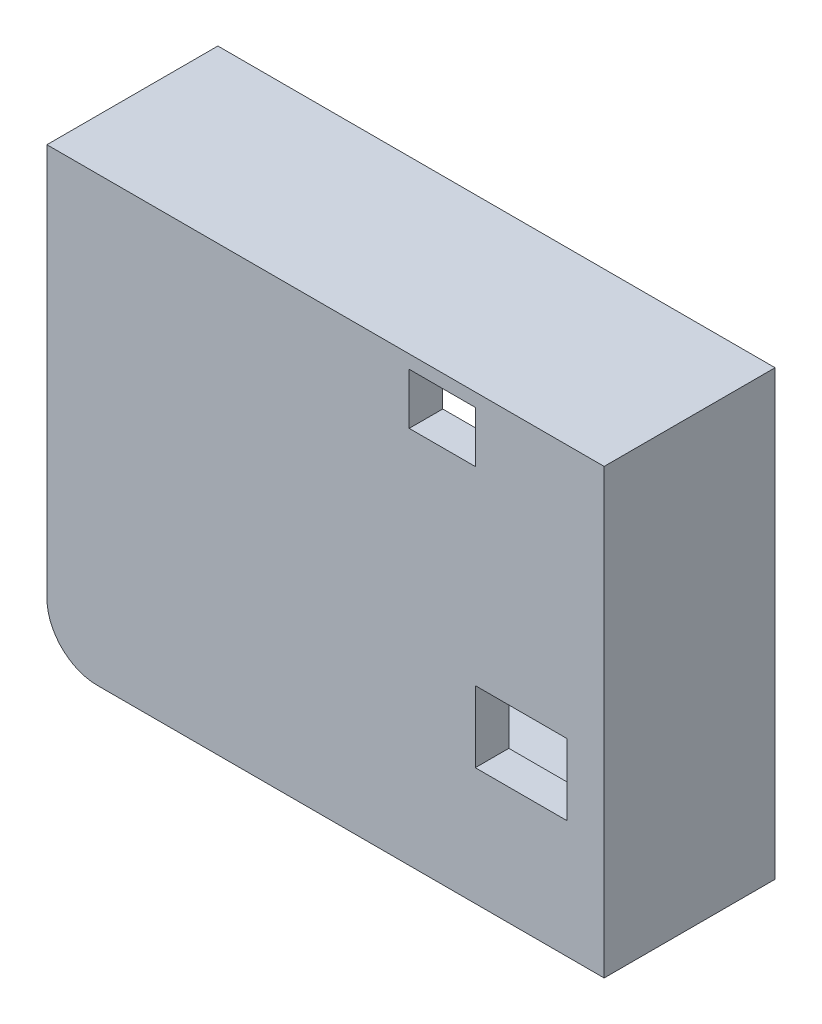
ISO-10303-21;
HEADER;
FILE_DESCRIPTION(('STEP AP214'),'2;1');
FILE_NAME('part.step','',(''),(''),'','','');
FILE_SCHEMA(('AUTOMOTIVE_DESIGN { 1 0 10303 214 1 1 1 1 }'));
ENDSEC;
DATA;
#1=APPLICATION_CONTEXT('core data for automotive mechanical design processes');
#2=APPLICATION_PROTOCOL_DEFINITION('international standard','automotive_design',2000,#1);
#3=PRODUCT_CONTEXT('',#1,'mechanical');
#4=PRODUCT('Part','Part','',(#3));
#5=PRODUCT_RELATED_PRODUCT_CATEGORY('part','',(#4));
#6=PRODUCT_DEFINITION_FORMATION('','',#4);
#7=PRODUCT_DEFINITION_CONTEXT('part definition',#1,'design');
#8=PRODUCT_DEFINITION('design','',#6,#7);
#9=PRODUCT_DEFINITION_SHAPE('','',#8);
#10=(LENGTH_UNIT() NAMED_UNIT(*) SI_UNIT(.MILLI.,.METRE.));
#11=(NAMED_UNIT(*) PLANE_ANGLE_UNIT() SI_UNIT($,.RADIAN.));
#12=(NAMED_UNIT(*) SI_UNIT($,.STERADIAN.) SOLID_ANGLE_UNIT());
#13=UNCERTAINTY_MEASURE_WITH_UNIT(LENGTH_MEASURE(1.E-05),#10,'distance_accuracy_value','');
#14=(GEOMETRIC_REPRESENTATION_CONTEXT(3) GLOBAL_UNCERTAINTY_ASSIGNED_CONTEXT((#13)) GLOBAL_UNIT_ASSIGNED_CONTEXT((#10,
#11,#12)) REPRESENTATION_CONTEXT('',''));
#15=CARTESIAN_POINT('',(0.,0.,0.));
#16=DIRECTION('',(0.,0.,1.));
#17=DIRECTION('',(1.,0.,0.));
#18=AXIS2_PLACEMENT_3D('',#15,#16,#17);
#19=CARTESIAN_POINT('',(0.,-125.165005985879,-48.6260540747564));
#20=DIRECTION('',(0.,-1.,0.));
#21=DIRECTION('',(0.,0.,-1.));
#22=AXIS2_PLACEMENT_3D('',#19,#20,#21);
#23=PLANE('',#22);
#24=DIRECTION('',(1.,0.,0.));
#25=VECTOR('',#24,1.);
#26=CARTESIAN_POINT('',(0.,-125.165005985879,4.));
#27=LINE('',#26,#25);
#28=CARTESIAN_POINT('',(134.091872,-125.165005985879,4.));
#29=VERTEX_POINT('',#28);
#30=CARTESIAN_POINT('',(164.307694987294,-125.165005985879,4.));
#31=VERTEX_POINT('',#30);
#32=EDGE_CURVE('E207',#29,#31,#27,.T.);
#33=ORIENTED_EDGE('',*,*,#32,.F.);
#34=DIRECTION('',(0.,0.,-1.));
#35=VECTOR('',#34,1.);
#36=CARTESIAN_POINT('',(134.091872,-125.165005985879,2.));
#37=LINE('',#36,#35);
#38=CARTESIAN_POINT('',(134.091872,-125.165005985879,2.));
#39=VERTEX_POINT('',#38);
#40=EDGE_CURVE('E313',#29,#39,#37,.T.);
#41=ORIENTED_EDGE('',*,*,#40,.T.);
#42=DIRECTION('',(0.,0.,1.));
#43=VECTOR('',#42,1.);
#44=CARTESIAN_POINT('',(134.091872,-125.165005985879,-6.19000000000001));
#45=LINE('',#44,#43);
#46=CARTESIAN_POINT('',(134.091872,-125.165005985879,-6.19000000000001));
#47=VERTEX_POINT('',#46);
#48=EDGE_CURVE('E304',#39,#47,#45,.F.);
#49=ORIENTED_EDGE('',*,*,#48,.T.);
#50=DIRECTION('',(-1.,0.,0.));
#51=VECTOR('',#50,1.);
#52=CARTESIAN_POINT('',(0.,-125.165005985879,-6.19000000000001));
#53=LINE('',#52,#51);
#54=CARTESIAN_POINT('',(164.307694987294,-125.165005985879,-6.19000000000001));
#55=VERTEX_POINT('',#54);
#56=EDGE_CURVE('E252',#55,#47,#53,.T.);
#57=ORIENTED_EDGE('',*,*,#56,.F.);
#58=DIRECTION('',(0.,0.,1.));
#59=VECTOR('',#58,1.);
#60=CARTESIAN_POINT('',(164.307694987294,-125.165005985879,-48.6260540747564));
#61=LINE('',#60,#59);
#62=EDGE_CURVE('E244',#55,#31,#61,.T.);
#63=ORIENTED_EDGE('',*,*,#62,.T.);
#64=EDGE_LOOP('',(#33,#41,#49,#57,#63));
#65=FACE_BOUND('',#64,.T.);
#66=ADVANCED_FACE('F35',(#65),#23,.T.);
#67=CARTESIAN_POINT('',(131.091872,0.,-48.6260540747564));
#68=DIRECTION('',(1.,0.,0.));
#69=DIRECTION('',(0.,0.,-1.));
#70=AXIS2_PLACEMENT_3D('',#67,#68,#69);
#71=PLANE('',#70);
#72=DIRECTION('',(0.,0.,1.));
#73=VECTOR('',#72,1.);
#74=CARTESIAN_POINT('',(131.091872,-122.165005985879,2.));
#75=LINE('',#74,#73);
#76=CARTESIAN_POINT('',(131.091872,-122.165005985879,-6.19000000000001));
#77=VERTEX_POINT('',#76);
#78=CARTESIAN_POINT('',(131.091872,-122.165005985879,2.));
#79=VERTEX_POINT('',#78);
#80=EDGE_CURVE('E300',#77,#79,#75,.T.);
#81=ORIENTED_EDGE('',*,*,#80,.T.);
#82=DIRECTION('',(0.,0.,-1.));
#83=VECTOR('',#82,1.);
#84=CARTESIAN_POINT('',(131.091872,-122.165005985879,4.));
#85=LINE('',#84,#83);
#86=CARTESIAN_POINT('',(131.091872,-122.165005985879,4.));
#87=VERTEX_POINT('',#86);
#88=EDGE_CURVE('E43',#79,#87,#85,.F.);
#89=ORIENTED_EDGE('',*,*,#88,.T.);
#90=DIRECTION('',(0.,1.,0.));
#91=VECTOR('',#90,1.);
#92=CARTESIAN_POINT('',(131.091872,0.,4.));
#93=LINE('',#92,#91);
#94=CARTESIAN_POINT('',(131.091872,-98.7542546010274,4.));
#95=VERTEX_POINT('',#94);
#96=EDGE_CURVE('E215',#87,#95,#93,.T.);
#97=ORIENTED_EDGE('',*,*,#96,.T.);
#98=DIRECTION('',(0.,0.,1.));
#99=VECTOR('',#98,1.);
#100=CARTESIAN_POINT('',(131.091872,-98.7542546010274,-48.6260540747564));
#101=LINE('',#100,#99);
#102=CARTESIAN_POINT('',(131.091872,-98.7542546010274,-6.19000000000001));
#103=VERTEX_POINT('',#102);
#104=EDGE_CURVE('E268',#103,#95,#101,.T.);
#105=ORIENTED_EDGE('',*,*,#104,.F.);
#106=DIRECTION('',(0.,-1.,0.));
#107=VECTOR('',#106,1.);
#108=CARTESIAN_POINT('',(131.091872,0.,-6.19000000000001));
#109=LINE('',#108,#107);
#110=EDGE_CURVE('E276',#103,#77,#109,.T.);
#111=ORIENTED_EDGE('',*,*,#110,.T.);
#112=EDGE_LOOP('',(#81,#89,#97,#105,#111));
#113=FACE_BOUND('',#112,.T.);
#114=ADVANCED_FACE('F328',(#113),#71,.F.);
#115=CARTESIAN_POINT('',(0.,-98.7542546010274,-48.6260540747564));
#116=DIRECTION('',(0.,-1.,0.));
#117=DIRECTION('',(0.,0.,-1.));
#118=AXIS2_PLACEMENT_3D('',#115,#116,#117);
#119=PLANE('',#118);
#120=DIRECTION('',(0.,0.,1.));
#121=VECTOR('',#120,1.);
#122=CARTESIAN_POINT('',(164.307694987294,-98.7542546010274,-48.6260540747564));
#123=LINE('',#122,#121);
#124=CARTESIAN_POINT('',(164.307694987294,-98.7542546010274,-6.19000000000001));
#125=VERTEX_POINT('',#124);
#126=CARTESIAN_POINT('',(164.307694987294,-98.7542546010274,4.));
#127=VERTEX_POINT('',#126);
#128=EDGE_CURVE('E256',#125,#127,#123,.T.);
#129=ORIENTED_EDGE('',*,*,#128,.F.);
#130=DIRECTION('',(-1.,0.,0.));
#131=VECTOR('',#130,1.);
#132=CARTESIAN_POINT('',(0.,-98.7542546010274,-6.19000000000001));
#133=LINE('',#132,#131);
#134=EDGE_CURVE('E272',#125,#103,#133,.T.);
#135=ORIENTED_EDGE('',*,*,#134,.T.);
#136=ORIENTED_EDGE('',*,*,#104,.T.);
#137=DIRECTION('',(1.,0.,0.));
#138=VECTOR('',#137,1.);
#139=CARTESIAN_POINT('',(0.,-98.7542546010274,4.));
#140=LINE('',#139,#138);
#141=EDGE_CURVE('E212',#95,#127,#140,.T.);
#142=ORIENTED_EDGE('',*,*,#141,.T.);
#143=EDGE_LOOP('',(#129,#135,#136,#142));
#144=FACE_BOUND('',#143,.T.);
#145=ADVANCED_FACE('F332',(#144),#119,.F.);
#146=CARTESIAN_POINT('',(133.091872,0.,-48.6260540747564));
#147=DIRECTION('',(-1.,0.,0.));
#148=DIRECTION('',(0.,0.,1.));
#149=AXIS2_PLACEMENT_3D('',#146,#147,#148);
#150=PLANE('',#149);
#151=DIRECTION('',(0.,-1.,0.));
#152=VECTOR('',#151,1.);
#153=CARTESIAN_POINT('',(133.091872,0.,2.));
#154=LINE('',#153,#152);
#155=CARTESIAN_POINT('',(133.091872,-99.55,2.));
#156=VERTEX_POINT('',#155);
#157=CARTESIAN_POINT('',(133.091872,-120.165005985879,2.));
#158=VERTEX_POINT('',#157);
#159=EDGE_CURVE('E260',#156,#158,#154,.T.);
#160=ORIENTED_EDGE('',*,*,#159,.T.);
#161=DIRECTION('',(0.,0.,1.));
#162=VECTOR('',#161,1.);
#163=CARTESIAN_POINT('',(133.091872,-120.165005985879,-48.6260540747564));
#164=LINE('',#163,#162);
#165=CARTESIAN_POINT('',(133.091872,-120.165005985879,-6.19000000000001));
#166=VERTEX_POINT('',#165);
#167=EDGE_CURVE('E298',#158,#166,#164,.F.);
#168=ORIENTED_EDGE('',*,*,#167,.T.);
#169=DIRECTION('',(0.,1.,0.));
#170=VECTOR('',#169,1.);
#171=CARTESIAN_POINT('',(133.091872,0.,-6.19000000000001));
#172=LINE('',#171,#170);
#173=CARTESIAN_POINT('',(133.091872,-99.55,-6.19000000000001));
#174=VERTEX_POINT('',#173);
#175=EDGE_CURVE('E271',#166,#174,#172,.T.);
#176=ORIENTED_EDGE('',*,*,#175,.T.);
#177=DIRECTION('',(0.,0.,1.));
#178=VECTOR('',#177,1.);
#179=CARTESIAN_POINT('',(133.091872,-99.55,-48.6260540747564));
#180=LINE('',#179,#178);
#181=EDGE_CURVE('E264',#174,#156,#180,.T.);
#182=ORIENTED_EDGE('',*,*,#181,.T.);
#183=EDGE_LOOP('',(#160,#168,#176,#182));
#184=FACE_BOUND('',#183,.T.);
#185=ADVANCED_FACE('F391',(#184),#150,.F.);
#186=CARTESIAN_POINT('',(0.,-123.165005985879,-48.6260540747564));
#187=DIRECTION('',(0.,1.,0.));
#188=DIRECTION('',(0.,0.,1.));
#189=AXIS2_PLACEMENT_3D('',#186,#187,#188);
#190=PLANE('',#189);
#191=DIRECTION('',(1.,0.,0.));
#192=VECTOR('',#191,1.);
#193=CARTESIAN_POINT('',(0.,-123.165005985879,-6.19000000000001));
#194=LINE('',#193,#192);
#195=CARTESIAN_POINT('',(136.091872,-123.165005985879,-6.19000000000001));
#196=VERTEX_POINT('',#195);
#197=CARTESIAN_POINT('',(162.307694987294,-123.165005985879,-6.19000000000001));
#198=VERTEX_POINT('',#197);
#199=EDGE_CURVE('E267',#196,#198,#194,.T.);
#200=ORIENTED_EDGE('',*,*,#199,.F.);
#201=DIRECTION('',(0.,0.,1.));
#202=VECTOR('',#201,1.);
#203=CARTESIAN_POINT('',(136.091872,-123.165005985879,-48.6260540747564));
#204=LINE('',#203,#202);
#205=CARTESIAN_POINT('',(136.091872,-123.165005985879,2.));
#206=VERTEX_POINT('',#205);
#207=EDGE_CURVE('E287',#196,#206,#204,.T.);
#208=ORIENTED_EDGE('',*,*,#207,.T.);
#209=DIRECTION('',(-1.,0.,0.));
#210=VECTOR('',#209,1.);
#211=CARTESIAN_POINT('',(0.,-123.165005985879,2.));
#212=LINE('',#211,#210);
#213=CARTESIAN_POINT('',(162.307694987294,-123.165005985879,2.));
#214=VERTEX_POINT('',#213);
#215=EDGE_CURVE('E249',#214,#206,#212,.T.);
#216=ORIENTED_EDGE('',*,*,#215,.F.);
#217=DIRECTION('',(0.,0.,1.));
#218=VECTOR('',#217,1.);
#219=CARTESIAN_POINT('',(162.307694987294,-123.165005985879,-48.6260540747564));
#220=LINE('',#219,#218);
#221=EDGE_CURVE('E263',#198,#214,#220,.T.);
#222=ORIENTED_EDGE('',*,*,#221,.F.);
#223=EDGE_LOOP('',(#200,#208,#216,#222));
#224=FACE_BOUND('',#223,.T.);
#225=ADVANCED_FACE('F388',(#224),#190,.T.);
#226=CARTESIAN_POINT('',(162.307694987294,0.,-48.6260540747564));
#227=DIRECTION('',(-1.,0.,0.));
#228=DIRECTION('',(0.,0.,1.));
#229=AXIS2_PLACEMENT_3D('',#226,#227,#228);
#230=PLANE('',#229);
#231=DIRECTION('',(0.,1.,0.));
#232=VECTOR('',#231,1.);
#233=CARTESIAN_POINT('',(162.307694987294,0.,-6.19000000000001));
#234=LINE('',#233,#232);
#235=CARTESIAN_POINT('',(162.307694987294,-99.55,-6.19000000000001));
#236=VERTEX_POINT('',#235);
#237=EDGE_CURVE('E285',#198,#236,#234,.T.);
#238=ORIENTED_EDGE('',*,*,#237,.F.);
#239=ORIENTED_EDGE('',*,*,#221,.T.);
#240=DIRECTION('',(0.,-1.,0.));
#241=VECTOR('',#240,1.);
#242=CARTESIAN_POINT('',(162.307694987294,0.,2.));
#243=LINE('',#242,#241);
#244=CARTESIAN_POINT('',(162.307694987294,-99.55,2.));
#245=VERTEX_POINT('',#244);
#246=EDGE_CURVE('E253',#245,#214,#243,.T.);
#247=ORIENTED_EDGE('',*,*,#246,.F.);
#248=DIRECTION('',(0.,0.,1.));
#249=VECTOR('',#248,1.);
#250=CARTESIAN_POINT('',(162.307694987294,-99.55,-48.6260540747564));
#251=LINE('',#250,#249);
#252=EDGE_CURVE('E279',#236,#245,#251,.T.);
#253=ORIENTED_EDGE('',*,*,#252,.F.);
#254=EDGE_LOOP('',(#238,#239,#247,#253));
#255=FACE_BOUND('',#254,.T.);
#256=ADVANCED_FACE('F346',(#255),#230,.T.);
#257=CARTESIAN_POINT('',(0.,-99.55,-48.6260540747564));
#258=DIRECTION('',(0.,1.,0.));
#259=DIRECTION('',(0.,0.,1.));
#260=AXIS2_PLACEMENT_3D('',#257,#258,#259);
#261=PLANE('',#260);
#262=ORIENTED_EDGE('',*,*,#181,.F.);
#263=DIRECTION('',(1.,0.,0.));
#264=VECTOR('',#263,1.);
#265=CARTESIAN_POINT('',(0.,-99.55,-6.19000000000001));
#266=LINE('',#265,#264);
#267=EDGE_CURVE('E278',#174,#236,#266,.T.);
#268=ORIENTED_EDGE('',*,*,#267,.T.);
#269=ORIENTED_EDGE('',*,*,#252,.T.);
#270=DIRECTION('',(-1.,0.,0.));
#271=VECTOR('',#270,1.);
#272=CARTESIAN_POINT('',(0.,-99.55,2.));
#273=LINE('',#272,#271);
#274=CARTESIAN_POINT('',(156.626717908816,-99.55,2.));
#275=VERTEX_POINT('',#274);
#276=EDGE_CURVE('E257',#245,#275,#273,.T.);
#277=ORIENTED_EDGE('',*,*,#276,.T.);
#278=DIRECTION('',(0.,0.,-1.));
#279=VECTOR('',#278,1.);
#280=CARTESIAN_POINT('',(156.626717908816,-99.55,4.));
#281=LINE('',#280,#279);
#282=CARTESIAN_POINT('',(156.626717908816,-99.55,4.));
#283=VERTEX_POINT('',#282);
#284=EDGE_CURVE('E186',#283,#275,#281,.T.);
#285=ORIENTED_EDGE('',*,*,#284,.F.);
#286=DIRECTION('',(-1.,0.,0.));
#287=VECTOR('',#286,1.);
#288=CARTESIAN_POINT('',(0.,-99.55,4.));
#289=LINE('',#288,#287);
#290=CARTESIAN_POINT('',(152.68714679013,-99.55,4.));
#291=VERTEX_POINT('',#290);
#292=EDGE_CURVE('E171',#283,#291,#289,.T.);
#293=ORIENTED_EDGE('',*,*,#292,.T.);
#294=DIRECTION('',(0.,0.,-1.));
#295=VECTOR('',#294,1.);
#296=CARTESIAN_POINT('',(152.68714679013,-99.55,4.));
#297=LINE('',#296,#295);
#298=CARTESIAN_POINT('',(152.68714679013,-99.55,2.));
#299=VERTEX_POINT('',#298);
#300=EDGE_CURVE('E180',#291,#299,#297,.T.);
#301=ORIENTED_EDGE('',*,*,#300,.T.);
#302=EDGE_CURVE('E259',#299,#156,#273,.T.);
#303=ORIENTED_EDGE('',*,*,#302,.T.);
#304=EDGE_LOOP('',(#262,#268,#269,#277,#285,#293,#301,#303));
#305=FACE_BOUND('',#304,.T.);
#306=ADVANCED_FACE('F189',(#305),#261,.F.);
#307=CARTESIAN_POINT('',(164.307694987294,0.,-48.6260540747564));
#308=DIRECTION('',(1.,0.,0.));
#309=DIRECTION('',(0.,0.,-1.));
#310=AXIS2_PLACEMENT_3D('',#307,#308,#309);
#311=PLANE('',#310);
#312=DIRECTION('',(0.,-1.,0.));
#313=VECTOR('',#312,1.);
#314=CARTESIAN_POINT('',(164.307694987294,0.,-6.19000000000001));
#315=LINE('',#314,#313);
#316=EDGE_CURVE('E265',#125,#55,#315,.T.);
#317=ORIENTED_EDGE('',*,*,#316,.F.);
#318=ORIENTED_EDGE('',*,*,#128,.T.);
#319=DIRECTION('',(0.,1.,0.));
#320=VECTOR('',#319,1.);
#321=CARTESIAN_POINT('',(164.307694987294,0.,4.));
#322=LINE('',#321,#320);
#323=EDGE_CURVE('E209',#31,#127,#322,.T.);
#324=ORIENTED_EDGE('',*,*,#323,.F.);
#325=ORIENTED_EDGE('',*,*,#62,.F.);
#326=EDGE_LOOP('',(#317,#318,#324,#325));
#327=FACE_BOUND('',#326,.T.);
#328=ADVANCED_FACE('F337',(#327),#311,.T.);
#329=CARTESIAN_POINT('',(66.491872,-224.748043974981,-6.19000000000001));
#330=DIRECTION('',(0.,0.,1.));
#331=DIRECTION('',(0.,1.,0.));
#332=AXIS2_PLACEMENT_3D('',#329,#330,#331);
#333=PLANE('',#332);
#334=ORIENTED_EDGE('',*,*,#56,.T.);
#335=CARTESIAN_POINT('',(134.091872,-122.165005985879,-6.19000000000001));
#336=DIRECTION('',(0.,0.,1.));
#337=DIRECTION('',(0.,-1.,0.));
#338=AXIS2_PLACEMENT_3D('',#335,#336,#337);
#339=CIRCLE('',#338,3.);
#340=EDGE_CURVE('E306',#47,#77,#339,.F.);
#341=ORIENTED_EDGE('',*,*,#340,.T.);
#342=ORIENTED_EDGE('',*,*,#110,.F.);
#343=ORIENTED_EDGE('',*,*,#134,.F.);
#344=ORIENTED_EDGE('',*,*,#316,.T.);
#345=EDGE_LOOP('',(#334,#341,#342,#343,#344));
#346=FACE_BOUND('',#345,.T.);
#347=ORIENTED_EDGE('',*,*,#175,.F.);
#348=CARTESIAN_POINT('',(136.091872,-120.165005985879,-6.19000000000001));
#349=DIRECTION('',(0.,0.,1.));
#350=DIRECTION('',(0.,-1.,0.));
#351=AXIS2_PLACEMENT_3D('',#348,#349,#350);
#352=CIRCLE('',#351,3.);
#353=EDGE_CURVE('E311',#166,#196,#352,.T.);
#354=ORIENTED_EDGE('',*,*,#353,.T.);
#355=ORIENTED_EDGE('',*,*,#199,.T.);
#356=ORIENTED_EDGE('',*,*,#237,.T.);
#357=ORIENTED_EDGE('',*,*,#267,.F.);
#358=EDGE_LOOP('',(#347,#354,#355,#356,#357));
#359=FACE_BOUND('',#358,.T.);
#360=ADVANCED_FACE('F325',(#346,#359),#333,.F.);
#361=CARTESIAN_POINT('',(136.091872,-120.165005985879,-48.6260540747564));
#362=DIRECTION('',(0.,0.,1.));
#363=DIRECTION('',(1.,0.,0.));
#364=AXIS2_PLACEMENT_3D('',#361,#362,#363);
#365=CYLINDRICAL_SURFACE('',#364,3.);
#366=ORIENTED_EDGE('',*,*,#353,.F.);
#367=ORIENTED_EDGE('',*,*,#167,.F.);
#368=CARTESIAN_POINT('',(136.091872,-120.165005985879,2.));
#369=DIRECTION('',(0.,0.,1.));
#370=DIRECTION('',(1.,0.,0.));
#371=AXIS2_PLACEMENT_3D('',#368,#369,#370);
#372=CIRCLE('',#371,3.);
#373=EDGE_CURVE('E308',#206,#158,#372,.F.);
#374=ORIENTED_EDGE('',*,*,#373,.F.);
#375=ORIENTED_EDGE('',*,*,#207,.F.);
#376=EDGE_LOOP('',(#366,#367,#374,#375));
#377=FACE_BOUND('',#376,.T.);
#378=ADVANCED_FACE('F344',(#377),#365,.F.);
#379=CARTESIAN_POINT('',(134.091872,-122.165005985879,-48.6260540747564));
#380=DIRECTION('',(0.,0.,-1.));
#381=DIRECTION('',(-1.,0.,0.));
#382=AXIS2_PLACEMENT_3D('',#379,#380,#381);
#383=CYLINDRICAL_SURFACE('',#382,3.);
#384=ORIENTED_EDGE('',*,*,#340,.F.);
#385=ORIENTED_EDGE('',*,*,#48,.F.);
#386=CARTESIAN_POINT('',(134.091872,-122.165005985879,2.));
#387=DIRECTION('',(0.,0.,1.));
#388=DIRECTION('',(1.,0.,0.));
#389=AXIS2_PLACEMENT_3D('',#386,#387,#388);
#390=CIRCLE('',#389,3.);
#391=EDGE_CURVE('E302',#79,#39,#390,.T.);
#392=ORIENTED_EDGE('',*,*,#391,.F.);
#393=ORIENTED_EDGE('',*,*,#80,.F.);
#394=EDGE_LOOP('',(#384,#385,#392,#393));
#395=FACE_BOUND('',#394,.T.);
#396=ADVANCED_FACE('F322',(#395),#383,.T.);
#397=CARTESIAN_POINT('',(0.,-118.15,4.));
#398=DIRECTION('',(0.,-1.,0.));
#399=DIRECTION('',(0.,0.,-1.));
#400=AXIS2_PLACEMENT_3D('',#397,#398,#399);
#401=PLANE('',#400);
#402=DIRECTION('',(-1.,0.,0.));
#403=VECTOR('',#402,1.);
#404=CARTESIAN_POINT('',(0.,-118.15,2.));
#405=LINE('',#404,#403);
#406=CARTESIAN_POINT('',(162.1,-118.15,2.));
#407=VERTEX_POINT('',#406);
#408=CARTESIAN_POINT('',(156.626717908816,-118.15,2.));
#409=VERTEX_POINT('',#408);
#410=EDGE_CURVE('E225',#407,#409,#405,.T.);
#411=ORIENTED_EDGE('',*,*,#410,.T.);
#412=DIRECTION('',(0.,0.,-1.));
#413=VECTOR('',#412,1.);
#414=CARTESIAN_POINT('',(156.626717908816,-118.15,4.));
#415=LINE('',#414,#413);
#416=CARTESIAN_POINT('',(156.626717908816,-118.15,4.));
#417=VERTEX_POINT('',#416);
#418=EDGE_CURVE('E241',#417,#409,#415,.T.);
#419=ORIENTED_EDGE('',*,*,#418,.F.);
#420=DIRECTION('',(-1.,0.,0.));
#421=VECTOR('',#420,1.);
#422=CARTESIAN_POINT('',(0.,-118.15,4.));
#423=LINE('',#422,#421);
#424=CARTESIAN_POINT('',(162.1,-118.15,4.));
#425=VERTEX_POINT('',#424);
#426=EDGE_CURVE('E196',#425,#417,#423,.T.);
#427=ORIENTED_EDGE('',*,*,#426,.F.);
#428=DIRECTION('',(0.,0.,-1.));
#429=VECTOR('',#428,1.);
#430=CARTESIAN_POINT('',(162.1,-118.15,4.));
#431=LINE('',#430,#429);
#432=EDGE_CURVE('E185',#425,#407,#431,.T.);
#433=ORIENTED_EDGE('',*,*,#432,.T.);
#434=EDGE_LOOP('',(#411,#419,#427,#433));
#435=FACE_BOUND('',#434,.T.);
#436=ADVANCED_FACE('F360',(#435),#401,.F.);
#437=CARTESIAN_POINT('',(156.626717908816,0.,4.));
#438=DIRECTION('',(-1.,0.,0.));
#439=DIRECTION('',(0.,0.,1.));
#440=AXIS2_PLACEMENT_3D('',#437,#438,#439);
#441=PLANE('',#440);
#442=DIRECTION('',(0.,1.,0.));
#443=VECTOR('',#442,1.);
#444=CARTESIAN_POINT('',(156.626717908816,0.,2.));
#445=LINE('',#444,#443);
#446=CARTESIAN_POINT('',(156.626717908816,-113.910959391807,2.));
#447=VERTEX_POINT('',#446);
#448=EDGE_CURVE('E228',#409,#447,#445,.T.);
#449=ORIENTED_EDGE('',*,*,#448,.T.);
#450=DIRECTION('',(0.,0.,-1.));
#451=VECTOR('',#450,1.);
#452=CARTESIAN_POINT('',(156.626717908816,-113.910959391807,4.));
#453=LINE('',#452,#451);
#454=CARTESIAN_POINT('',(156.626717908816,-113.910959391807,4.));
#455=VERTEX_POINT('',#454);
#456=EDGE_CURVE('E239',#455,#447,#453,.T.);
#457=ORIENTED_EDGE('',*,*,#456,.F.);
#458=DIRECTION('',(0.,1.,0.));
#459=VECTOR('',#458,1.);
#460=CARTESIAN_POINT('',(156.626717908816,0.,4.));
#461=LINE('',#460,#459);
#462=EDGE_CURVE('E199',#417,#455,#461,.T.);
#463=ORIENTED_EDGE('',*,*,#462,.F.);
#464=ORIENTED_EDGE('',*,*,#418,.T.);
#465=EDGE_LOOP('',(#449,#457,#463,#464));
#466=FACE_BOUND('',#465,.T.);
#467=ADVANCED_FACE('F364',(#466),#441,.F.);
#468=CARTESIAN_POINT('',(0.,-113.910959391807,4.));
#469=DIRECTION('',(0.,-1.,0.));
#470=DIRECTION('',(0.,0.,-1.));
#471=AXIS2_PLACEMENT_3D('',#468,#469,#470);
#472=PLANE('',#471);
#473=DIRECTION('',(-1.,0.,0.));
#474=VECTOR('',#473,1.);
#475=CARTESIAN_POINT('',(0.,-113.910959391807,2.));
#476=LINE('',#475,#474);
#477=CARTESIAN_POINT('',(162.1,-113.910959391807,2.));
#478=VERTEX_POINT('',#477);
#479=EDGE_CURVE('E231',#478,#447,#476,.T.);
#480=ORIENTED_EDGE('',*,*,#479,.F.);
#481=DIRECTION('',(0.,0.,-1.));
#482=VECTOR('',#481,1.);
#483=CARTESIAN_POINT('',(162.1,-113.910959391807,4.));
#484=LINE('',#483,#482);
#485=CARTESIAN_POINT('',(162.1,-113.910959391807,4.));
#486=VERTEX_POINT('',#485);
#487=EDGE_CURVE('E237',#486,#478,#484,.T.);
#488=ORIENTED_EDGE('',*,*,#487,.F.);
#489=DIRECTION('',(-1.,0.,0.));
#490=VECTOR('',#489,1.);
#491=CARTESIAN_POINT('',(0.,-113.910959391807,4.));
#492=LINE('',#491,#490);
#493=EDGE_CURVE('E201',#486,#455,#492,.T.);
#494=ORIENTED_EDGE('',*,*,#493,.T.);
#495=ORIENTED_EDGE('',*,*,#456,.T.);
#496=EDGE_LOOP('',(#480,#488,#494,#495));
#497=FACE_BOUND('',#496,.T.);
#498=ADVANCED_FACE('F370',(#497),#472,.T.);
#499=CARTESIAN_POINT('',(152.68714679013,0.,4.));
#500=DIRECTION('',(-1.,0.,0.));
#501=DIRECTION('',(0.,0.,1.));
#502=AXIS2_PLACEMENT_3D('',#499,#500,#501);
#503=PLANE('',#502);
#504=DIRECTION('',(0.,1.,0.));
#505=VECTOR('',#504,1.);
#506=CARTESIAN_POINT('',(152.68714679013,0.,2.));
#507=LINE('',#506,#505);
#508=CARTESIAN_POINT('',(152.68714679013,-102.60116936667,2.));
#509=VERTEX_POINT('',#508);
#510=EDGE_CURVE('E183',#509,#299,#507,.T.);
#511=ORIENTED_EDGE('',*,*,#510,.T.);
#512=ORIENTED_EDGE('',*,*,#300,.F.);
#513=DIRECTION('',(0.,1.,0.));
#514=VECTOR('',#513,1.);
#515=CARTESIAN_POINT('',(152.68714679013,0.,4.));
#516=LINE('',#515,#514);
#517=CARTESIAN_POINT('',(152.68714679013,-102.60116936667,4.));
#518=VERTEX_POINT('',#517);
#519=EDGE_CURVE('E165',#518,#291,#516,.T.);
#520=ORIENTED_EDGE('',*,*,#519,.F.);
#521=DIRECTION('',(0.,0.,-1.));
#522=VECTOR('',#521,1.);
#523=CARTESIAN_POINT('',(152.68714679013,-102.60116936667,4.));
#524=LINE('',#523,#522);
#525=EDGE_CURVE('E217',#518,#509,#524,.T.);
#526=ORIENTED_EDGE('',*,*,#525,.T.);
#527=EDGE_LOOP('',(#511,#512,#520,#526));
#528=FACE_BOUND('',#527,.T.);
#529=ADVANCED_FACE('F181',(#528),#503,.F.);
#530=CARTESIAN_POINT('',(156.626717908816,0.,4.));
#531=DIRECTION('',(-1.,0.,0.));
#532=DIRECTION('',(0.,0.,1.));
#533=AXIS2_PLACEMENT_3D('',#530,#531,#532);
#534=PLANE('',#533);
#535=DIRECTION('',(0.,1.,0.));
#536=VECTOR('',#535,1.);
#537=CARTESIAN_POINT('',(156.626717908816,0.,2.));
#538=LINE('',#537,#536);
#539=CARTESIAN_POINT('',(156.626717908816,-102.60116936667,2.));
#540=VERTEX_POINT('',#539);
#541=EDGE_CURVE('E219',#540,#275,#538,.T.);
#542=ORIENTED_EDGE('',*,*,#541,.F.);
#543=DIRECTION('',(0.,0.,-1.));
#544=VECTOR('',#543,1.);
#545=CARTESIAN_POINT('',(156.626717908816,-102.60116936667,4.));
#546=LINE('',#545,#544);
#547=CARTESIAN_POINT('',(156.626717908816,-102.60116936667,4.));
#548=VERTEX_POINT('',#547);
#549=EDGE_CURVE('E246',#548,#540,#546,.T.);
#550=ORIENTED_EDGE('',*,*,#549,.F.);
#551=DIRECTION('',(0.,1.,0.));
#552=VECTOR('',#551,1.);
#553=CARTESIAN_POINT('',(156.626717908816,0.,4.));
#554=LINE('',#553,#552);
#555=EDGE_CURVE('E191',#548,#283,#554,.T.);
#556=ORIENTED_EDGE('',*,*,#555,.T.);
#557=ORIENTED_EDGE('',*,*,#284,.T.);
#558=EDGE_LOOP('',(#542,#550,#556,#557));
#559=FACE_BOUND('',#558,.T.);
#560=ADVANCED_FACE('F380',(#559),#534,.T.);
#561=CARTESIAN_POINT('',(162.1,0.,4.));
#562=DIRECTION('',(-1.,0.,0.));
#563=DIRECTION('',(0.,0.,1.));
#564=AXIS2_PLACEMENT_3D('',#561,#562,#563);
#565=PLANE('',#564);
#566=DIRECTION('',(0.,1.,0.));
#567=VECTOR('',#566,1.);
#568=CARTESIAN_POINT('',(162.1,0.,2.));
#569=LINE('',#568,#567);
#570=EDGE_CURVE('E176',#407,#478,#569,.T.);
#571=ORIENTED_EDGE('',*,*,#570,.F.);
#572=ORIENTED_EDGE('',*,*,#432,.F.);
#573=DIRECTION('',(0.,1.,0.));
#574=VECTOR('',#573,1.);
#575=CARTESIAN_POINT('',(162.1,0.,4.));
#576=LINE('',#575,#574);
#577=EDGE_CURVE('E204',#425,#486,#576,.T.);
#578=ORIENTED_EDGE('',*,*,#577,.T.);
#579=ORIENTED_EDGE('',*,*,#487,.T.);
#580=EDGE_LOOP('',(#571,#572,#578,#579));
#581=FACE_BOUND('',#580,.T.);
#582=ADVANCED_FACE('F378',(#581),#565,.T.);
#583=CARTESIAN_POINT('',(0.,-102.60116936667,4.));
#584=DIRECTION('',(0.,1.,0.));
#585=DIRECTION('',(0.,0.,1.));
#586=AXIS2_PLACEMENT_3D('',#583,#584,#585);
#587=PLANE('',#586);
#588=DIRECTION('',(1.,0.,0.));
#589=VECTOR('',#588,1.);
#590=CARTESIAN_POINT('',(0.,-102.60116936667,2.));
#591=LINE('',#590,#589);
#592=EDGE_CURVE('E222',#509,#540,#591,.T.);
#593=ORIENTED_EDGE('',*,*,#592,.F.);
#594=ORIENTED_EDGE('',*,*,#525,.F.);
#595=DIRECTION('',(1.,0.,0.));
#596=VECTOR('',#595,1.);
#597=CARTESIAN_POINT('',(0.,-102.60116936667,4.));
#598=LINE('',#597,#596);
#599=EDGE_CURVE('E174',#518,#548,#598,.T.);
#600=ORIENTED_EDGE('',*,*,#599,.T.);
#601=ORIENTED_EDGE('',*,*,#549,.T.);
#602=EDGE_LOOP('',(#593,#594,#600,#601));
#603=FACE_BOUND('',#602,.T.);
#604=ADVANCED_FACE('F375',(#603),#587,.T.);
#605=CARTESIAN_POINT('',(0.,0.,4.));
#606=DIRECTION('',(0.,0.,1.));
#607=DIRECTION('',(1.,0.,0.));
#608=AXIS2_PLACEMENT_3D('',#605,#606,#607);
#609=PLANE('',#608);
#610=ORIENTED_EDGE('',*,*,#519,.T.);
#611=ORIENTED_EDGE('',*,*,#292,.F.);
#612=ORIENTED_EDGE('',*,*,#555,.F.);
#613=ORIENTED_EDGE('',*,*,#599,.F.);
#614=EDGE_LOOP('',(#610,#611,#612,#613));
#615=FACE_BOUND('',#614,.T.);
#616=ORIENTED_EDGE('',*,*,#426,.T.);
#617=ORIENTED_EDGE('',*,*,#462,.T.);
#618=ORIENTED_EDGE('',*,*,#493,.F.);
#619=ORIENTED_EDGE('',*,*,#577,.F.);
#620=EDGE_LOOP('',(#616,#617,#618,#619));
#621=FACE_BOUND('',#620,.T.);
#622=ORIENTED_EDGE('',*,*,#96,.F.);
#623=CARTESIAN_POINT('',(134.091872,-122.165005985879,4.));
#624=DIRECTION('',(0.,0.,1.));
#625=DIRECTION('',(1.,0.,0.));
#626=AXIS2_PLACEMENT_3D('',#623,#624,#625);
#627=CIRCLE('',#626,3.);
#628=EDGE_CURVE('E11',#87,#29,#627,.T.);
#629=ORIENTED_EDGE('',*,*,#628,.T.);
#630=ORIENTED_EDGE('',*,*,#32,.T.);
#631=ORIENTED_EDGE('',*,*,#323,.T.);
#632=ORIENTED_EDGE('',*,*,#141,.F.);
#633=EDGE_LOOP('',(#622,#629,#630,#631,#632));
#634=FACE_BOUND('',#633,.T.);
#635=ADVANCED_FACE('F167',(#615,#621,#634),#609,.T.);
#636=CARTESIAN_POINT('',(0.,0.,2.));
#637=DIRECTION('',(0.,0.,1.));
#638=DIRECTION('',(1.,0.,0.));
#639=AXIS2_PLACEMENT_3D('',#636,#637,#638);
#640=PLANE('',#639);
#641=ORIENTED_EDGE('',*,*,#302,.F.);
#642=ORIENTED_EDGE('',*,*,#510,.F.);
#643=ORIENTED_EDGE('',*,*,#592,.T.);
#644=ORIENTED_EDGE('',*,*,#541,.T.);
#645=ORIENTED_EDGE('',*,*,#276,.F.);
#646=ORIENTED_EDGE('',*,*,#246,.T.);
#647=ORIENTED_EDGE('',*,*,#215,.T.);
#648=ORIENTED_EDGE('',*,*,#373,.T.);
#649=ORIENTED_EDGE('',*,*,#159,.F.);
#650=EDGE_LOOP('',(#641,#642,#643,#644,#645,#646,#647,#648,#649));
#651=FACE_BOUND('',#650,.T.);
#652=ORIENTED_EDGE('',*,*,#410,.F.);
#653=ORIENTED_EDGE('',*,*,#570,.T.);
#654=ORIENTED_EDGE('',*,*,#479,.T.);
#655=ORIENTED_EDGE('',*,*,#448,.F.);
#656=EDGE_LOOP('',(#652,#653,#654,#655));
#657=FACE_BOUND('',#656,.T.);
#658=ADVANCED_FACE('F401',(#651,#657),#640,.F.);
#659=CARTESIAN_POINT('',(134.091872,-122.165005985879,-48.6260540747564));
#660=DIRECTION('',(0.,0.,1.));
#661=DIRECTION('',(1.,0.,0.));
#662=AXIS2_PLACEMENT_3D('',#659,#660,#661);
#663=CYLINDRICAL_SURFACE('',#662,3.);
#664=ORIENTED_EDGE('',*,*,#628,.F.);
#665=ORIENTED_EDGE('',*,*,#88,.F.);
#666=ORIENTED_EDGE('',*,*,#391,.T.);
#667=ORIENTED_EDGE('',*,*,#40,.F.);
#668=EDGE_LOOP('',(#664,#665,#666,#667));
#669=FACE_BOUND('',#668,.T.);
#670=ADVANCED_FACE('F37',(#669),#663,.T.);
#671=CLOSED_SHELL('',(#66,#114,#145,#185,#225,#256,#306,#328,#360,#378,#396,#436,#467,#498,#529,
#560,#582,#604,#635,#658,#670));
#672=MANIFOLD_SOLID_BREP('B2',#671);
#673=ADVANCED_BREP_SHAPE_REPRESENTATION('',(#18,#672),#14);
#674=SHAPE_DEFINITION_REPRESENTATION(#9,#673);
ENDSEC;
END-ISO-10303-21;
